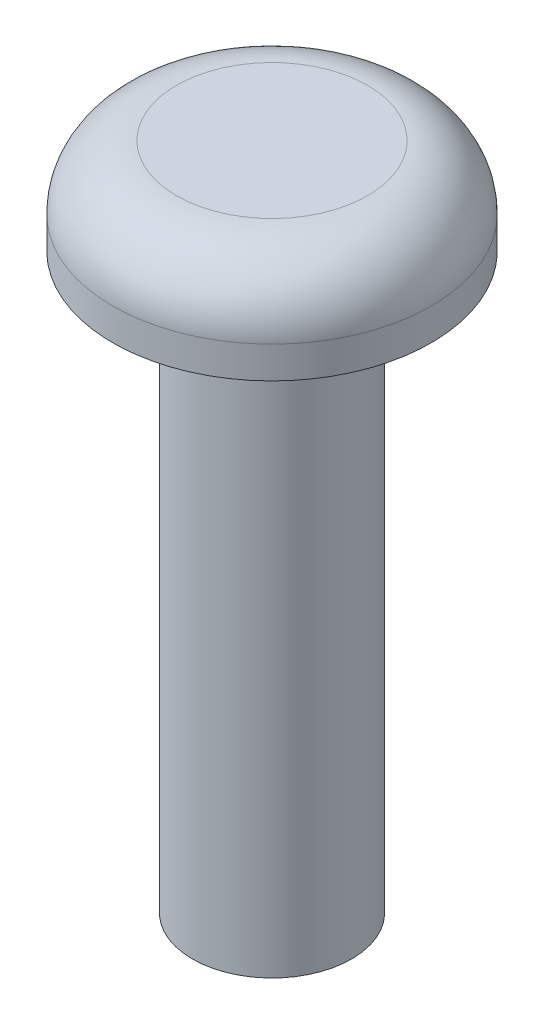
ISO-10303-21;
HEADER;
FILE_DESCRIPTION(('STEP AP214'),'2;1');
FILE_NAME('part.step','',(''),(''),'','','');
FILE_SCHEMA(('AUTOMOTIVE_DESIGN { 1 0 10303 214 1 1 1 1 }'));
ENDSEC;
DATA;
#1=APPLICATION_CONTEXT('core data for automotive mechanical design processes');
#2=APPLICATION_PROTOCOL_DEFINITION('international standard','automotive_design',2000,#1);
#3=PRODUCT_CONTEXT('',#1,'mechanical');
#4=PRODUCT('Part','Part','',(#3));
#5=PRODUCT_RELATED_PRODUCT_CATEGORY('part','',(#4));
#6=PRODUCT_DEFINITION_FORMATION('','',#4);
#7=PRODUCT_DEFINITION_CONTEXT('part definition',#1,'design');
#8=PRODUCT_DEFINITION('design','',#6,#7);
#9=PRODUCT_DEFINITION_SHAPE('','',#8);
#10=(LENGTH_UNIT() NAMED_UNIT(*) SI_UNIT(.MILLI.,.METRE.));
#11=(NAMED_UNIT(*) PLANE_ANGLE_UNIT() SI_UNIT($,.RADIAN.));
#12=(NAMED_UNIT(*) SI_UNIT($,.STERADIAN.) SOLID_ANGLE_UNIT());
#13=UNCERTAINTY_MEASURE_WITH_UNIT(LENGTH_MEASURE(1.E-05),#10,'distance_accuracy_value','');
#14=(GEOMETRIC_REPRESENTATION_CONTEXT(3) GLOBAL_UNCERTAINTY_ASSIGNED_CONTEXT((#13)) GLOBAL_UNIT_ASSIGNED_CONTEXT((#10,
#11,#12)) REPRESENTATION_CONTEXT('',''));
#15=CARTESIAN_POINT('',(0.,0.,0.));
#16=DIRECTION('',(0.,0.,1.));
#17=DIRECTION('',(1.,0.,0.));
#18=AXIS2_PLACEMENT_3D('',#15,#16,#17);
#19=CARTESIAN_POINT('',(0.,4.572,0.));
#20=DIRECTION('',(0.,-1.,0.));
#21=DIRECTION('',(0.,0.,-1.));
#22=AXIS2_PLACEMENT_3D('',#19,#20,#21);
#23=CYLINDRICAL_SURFACE('',#22,0.635);
#24=CARTESIAN_POINT('',(0.,4.572,0.));
#25=DIRECTION('',(0.,1.,0.));
#26=DIRECTION('',(0.,0.,1.));
#27=AXIS2_PLACEMENT_3D('',#24,#25,#26);
#28=CIRCLE('',#27,0.635);
#29=CARTESIAN_POINT('',(0.,4.572,0.635));
#30=VERTEX_POINT('',#29);
#31=EDGE_CURVE('E42',#30,#30,#28,.T.);
#32=ORIENTED_EDGE('',*,*,#31,.F.);
#33=EDGE_LOOP('',(#32));
#34=FACE_BOUND('',#33,.T.);
#35=CARTESIAN_POINT('',(0.,0.,0.));
#36=DIRECTION('',(0.,1.,0.));
#37=DIRECTION('',(0.,0.,1.));
#38=AXIS2_PLACEMENT_3D('',#35,#36,#37);
#39=CIRCLE('',#38,0.635);
#40=CARTESIAN_POINT('',(0.,0.,0.635));
#41=VERTEX_POINT('',#40);
#42=EDGE_CURVE('E46',#41,#41,#39,.T.);
#43=ORIENTED_EDGE('',*,*,#42,.T.);
#44=EDGE_LOOP('',(#43));
#45=FACE_BOUND('',#44,.T.);
#46=ADVANCED_FACE('F31',(#34,#45),#23,.T.);
#47=CARTESIAN_POINT('',(0.,0.,0.));
#48=DIRECTION('',(0.,1.,0.));
#49=DIRECTION('',(0.,0.,1.));
#50=AXIS2_PLACEMENT_3D('',#47,#48,#49);
#51=PLANE('',#50);
#52=ORIENTED_EDGE('',*,*,#42,.F.);
#53=EDGE_LOOP('',(#52));
#54=FACE_BOUND('',#53,.T.);
#55=ADVANCED_FACE('F60',(#54),#51,.F.);
#56=CARTESIAN_POINT('',(0.,4.572,0.));
#57=DIRECTION('',(0.,1.,0.));
#58=DIRECTION('',(0.,0.,1.));
#59=AXIS2_PLACEMENT_3D('',#56,#57,#58);
#60=PLANE('',#59);
#61=CARTESIAN_POINT('',(0.,4.572,0.));
#62=DIRECTION('',(0.,1.,0.));
#63=DIRECTION('',(0.,0.,1.));
#64=AXIS2_PLACEMENT_3D('',#61,#62,#63);
#65=CIRCLE('',#64,1.27);
#66=CARTESIAN_POINT('',(0.,4.572,-1.27));
#67=VERTEX_POINT('',#66);
#68=EDGE_CURVE('E50',#67,#67,#65,.T.);
#69=ORIENTED_EDGE('',*,*,#68,.F.);
#70=EDGE_LOOP('',(#69));
#71=FACE_BOUND('',#70,.T.);
#72=ORIENTED_EDGE('',*,*,#31,.T.);
#73=EDGE_LOOP('',(#72));
#74=FACE_BOUND('',#73,.T.);
#75=ADVANCED_FACE('F57',(#71,#74),#60,.F.);
#76=CARTESIAN_POINT('',(0.,5.334,0.));
#77=DIRECTION('',(0.,-1.,0.));
#78=DIRECTION('',(0.,0.,-1.));
#79=AXIS2_PLACEMENT_3D('',#76,#77,#78);
#80=CYLINDRICAL_SURFACE('',#79,1.27);
#81=CARTESIAN_POINT('',(0.,4.826,0.));
#82=DIRECTION('',(0.,1.,0.));
#83=DIRECTION('',(0.,0.,1.));
#84=AXIS2_PLACEMENT_3D('',#81,#82,#83);
#85=CIRCLE('',#84,1.27);
#86=CARTESIAN_POINT('',(0.,4.826,-1.27));
#87=VERTEX_POINT('',#86);
#88=EDGE_CURVE('E10',#87,#87,#85,.F.);
#89=CARTESIAN_POINT('',(0.,4.826,-1.27));
#90=CARTESIAN_POINT('',(0.,4.82335416666667,-1.27));
#91=CARTESIAN_POINT('',(0.,4.82070833333333,-1.27));
#92=CARTESIAN_POINT('',(0.,4.81541666666667,-1.27));
#93=CARTESIAN_POINT('',(0.,4.81277083333333,-1.27));
#94=CARTESIAN_POINT('',(0.,4.80747916666667,-1.27));
#95=CARTESIAN_POINT('',(0.,4.80483333333333,-1.27));
#96=CARTESIAN_POINT('',(0.,4.79954166666667,-1.27));
#97=CARTESIAN_POINT('',(0.,4.79689583333333,-1.27));
#98=CARTESIAN_POINT('',(0.,4.79160416666667,-1.27));
#99=CARTESIAN_POINT('',(0.,4.78895833333333,-1.27));
#100=CARTESIAN_POINT('',(0.,4.78366666666667,-1.27));
#101=CARTESIAN_POINT('',(0.,4.78102083333333,-1.27));
#102=CARTESIAN_POINT('',(0.,4.77572916666667,-1.27));
#103=CARTESIAN_POINT('',(0.,4.77308333333333,-1.27));
#104=CARTESIAN_POINT('',(0.,4.76779166666667,-1.27));
#105=CARTESIAN_POINT('',(0.,4.76514583333333,-1.27));
#106=CARTESIAN_POINT('',(0.,4.75985416666667,-1.27));
#107=CARTESIAN_POINT('',(0.,4.75720833333333,-1.27));
#108=CARTESIAN_POINT('',(0.,4.75191666666667,-1.27));
#109=CARTESIAN_POINT('',(0.,4.74927083333333,-1.27));
#110=CARTESIAN_POINT('',(0.,4.74397916666667,-1.27));
#111=CARTESIAN_POINT('',(0.,4.74133333333333,-1.27));
#112=CARTESIAN_POINT('',(0.,4.73604166666667,-1.27));
#113=CARTESIAN_POINT('',(0.,4.73339583333333,-1.27));
#114=CARTESIAN_POINT('',(0.,4.72810416666667,-1.27));
#115=CARTESIAN_POINT('',(0.,4.72545833333333,-1.27));
#116=CARTESIAN_POINT('',(0.,4.72016666666667,-1.27));
#117=CARTESIAN_POINT('',(0.,4.71752083333333,-1.27));
#118=CARTESIAN_POINT('',(0.,4.71222916666667,-1.27));
#119=CARTESIAN_POINT('',(0.,4.70958333333333,-1.27));
#120=CARTESIAN_POINT('',(0.,4.70429166666667,-1.27));
#121=CARTESIAN_POINT('',(0.,4.70164583333333,-1.27));
#122=CARTESIAN_POINT('',(0.,4.69635416666667,-1.27));
#123=CARTESIAN_POINT('',(0.,4.69370833333333,-1.27));
#124=CARTESIAN_POINT('',(0.,4.68841666666667,-1.27));
#125=CARTESIAN_POINT('',(0.,4.68577083333333,-1.27));
#126=CARTESIAN_POINT('',(0.,4.68047916666667,-1.27));
#127=CARTESIAN_POINT('',(0.,4.67783333333333,-1.27));
#128=CARTESIAN_POINT('',(0.,4.67254166666667,-1.27));
#129=CARTESIAN_POINT('',(0.,4.66989583333333,-1.27));
#130=CARTESIAN_POINT('',(0.,4.66460416666667,-1.27));
#131=CARTESIAN_POINT('',(0.,4.66195833333333,-1.27));
#132=CARTESIAN_POINT('',(0.,4.65666666666667,-1.27));
#133=CARTESIAN_POINT('',(0.,4.65402083333333,-1.27));
#134=CARTESIAN_POINT('',(0.,4.64872916666667,-1.27));
#135=CARTESIAN_POINT('',(0.,4.64608333333333,-1.27));
#136=CARTESIAN_POINT('',(0.,4.64079166666667,-1.27));
#137=CARTESIAN_POINT('',(0.,4.63814583333333,-1.27));
#138=CARTESIAN_POINT('',(0.,4.63285416666667,-1.27));
#139=CARTESIAN_POINT('',(0.,4.63020833333333,-1.27));
#140=CARTESIAN_POINT('',(0.,4.62491666666666,-1.27));
#141=CARTESIAN_POINT('',(0.,4.62227083333333,-1.27));
#142=CARTESIAN_POINT('',(0.,4.61697916666667,-1.27));
#143=CARTESIAN_POINT('',(0.,4.61433333333333,-1.27));
#144=CARTESIAN_POINT('',(0.,4.60904166666667,-1.27));
#145=CARTESIAN_POINT('',(0.,4.60639583333333,-1.27));
#146=CARTESIAN_POINT('',(0.,4.60110416666667,-1.27));
#147=CARTESIAN_POINT('',(0.,4.59845833333333,-1.27));
#148=CARTESIAN_POINT('',(0.,4.59316666666667,-1.27));
#149=CARTESIAN_POINT('',(0.,4.59052083333333,-1.27));
#150=CARTESIAN_POINT('',(0.,4.58522916666667,-1.27));
#151=CARTESIAN_POINT('',(0.,4.58258333333333,-1.27));
#152=CARTESIAN_POINT('',(0.,4.57729166666667,-1.27));
#153=CARTESIAN_POINT('',(0.,4.57464583333333,-1.27));
#154=CARTESIAN_POINT('',(0.,4.572,-1.27));
#155=B_SPLINE_CURVE_WITH_KNOTS('',3,(#89,#90,#91,#92,#93,#94,#95,#96,#97,#98,#99,#100,#101,#102,
#103,#104,#105,#106,#107,#108,#109,#110,#111,#112,#113,#114,#115,#116,#117,#118,#119,#120,#121,
#122,#123,#124,#125,#126,#127,#128,#129,#130,#131,#132,#133,#134,#135,#136,#137,#138,#139,#140,
#141,#142,#143,#144,#145,#146,#147,#148,#149,#150,#151,#152,#153,#154),.UNSPECIFIED.,.F.,.F.,(4,
2,2,2,2,2,2,2,2,2,2,2,2,2,2,2,2,2,2,2,2,2,2,2,2,2,2,2,2,2,2,2,4),(0.,0.00793750000000013,
0.0158750000000003,0.0238125000000004,0.0317500000000005,0.0396875000000007,0.0476249999999999,
0.0555625000000001,0.0635000000000002,0.0714375000000003,0.0793750000000004,0.0873125000000006,
0.0952500000000007,0.1031875,0.111125,0.1190625,0.127,0.134937500000001,0.142875000000001,
0.150812500000001,0.15875,0.1666875,0.174625,0.1825625,0.190500000000001,0.198437500000001,
0.206375000000001,0.2143125,0.22225,0.2301875,0.238125,0.246062500000001,0.254000000000001),.UNSPECIFIED.);
#156=EDGE_CURVE('BSEAM55',#87,#67,#155,.T.);
#157=ORIENTED_EDGE('',*,*,#88,.T.);
#158=ORIENTED_EDGE('',*,*,#68,.T.);
#159=ORIENTED_EDGE('',*,*,#156,.T.);
#160=ORIENTED_EDGE('',*,*,#156,.F.);
#161=EDGE_LOOP('',(#157,#159,#158,#160));
#162=FACE_BOUND('',#161,.T.);
#163=ADVANCED_FACE('F55',(#162),#80,.T.);
#164=CARTESIAN_POINT('',(0.,5.334,0.));
#165=DIRECTION('',(0.,1.,0.));
#166=DIRECTION('',(0.,0.,1.));
#167=AXIS2_PLACEMENT_3D('',#164,#165,#166);
#168=PLANE('',#167);
#169=CARTESIAN_POINT('',(0.,5.334,0.));
#170=DIRECTION('',(0.,1.,0.));
#171=DIRECTION('',(0.,0.,1.));
#172=AXIS2_PLACEMENT_3D('',#169,#170,#171);
#173=CIRCLE('',#172,0.762);
#174=CARTESIAN_POINT('',(0.,5.334,0.762));
#175=VERTEX_POINT('',#174);
#176=EDGE_CURVE('E38',#175,#175,#173,.T.);
#177=ORIENTED_EDGE('',*,*,#176,.T.);
#178=EDGE_LOOP('',(#177));
#179=FACE_BOUND('',#178,.T.);
#180=ADVANCED_FACE('F74',(#179),#168,.T.);
#181=CARTESIAN_POINT('',(0.,4.826,0.));
#182=DIRECTION('',(0.,1.,0.));
#183=DIRECTION('',(0.,0.,1.));
#184=AXIS2_PLACEMENT_3D('',#181,#182,#183);
#185=TOROIDAL_SURFACE('',#184,0.762,0.508);
#186=ORIENTED_EDGE('',*,*,#88,.F.);
#187=EDGE_LOOP('',(#186));
#188=FACE_BOUND('',#187,.T.);
#189=ORIENTED_EDGE('',*,*,#176,.F.);
#190=EDGE_LOOP('',(#189));
#191=FACE_BOUND('',#190,.T.);
#192=ADVANCED_FACE('F33',(#188,#191),#185,.T.);
#193=CLOSED_SHELL('',(#46,#55,#75,#163,#180,#192));
#194=MANIFOLD_SOLID_BREP('B2',#193);
#195=ADVANCED_BREP_SHAPE_REPRESENTATION('',(#18,#194),#14);
#196=SHAPE_DEFINITION_REPRESENTATION(#9,#195);
ENDSEC;
END-ISO-10303-21;
